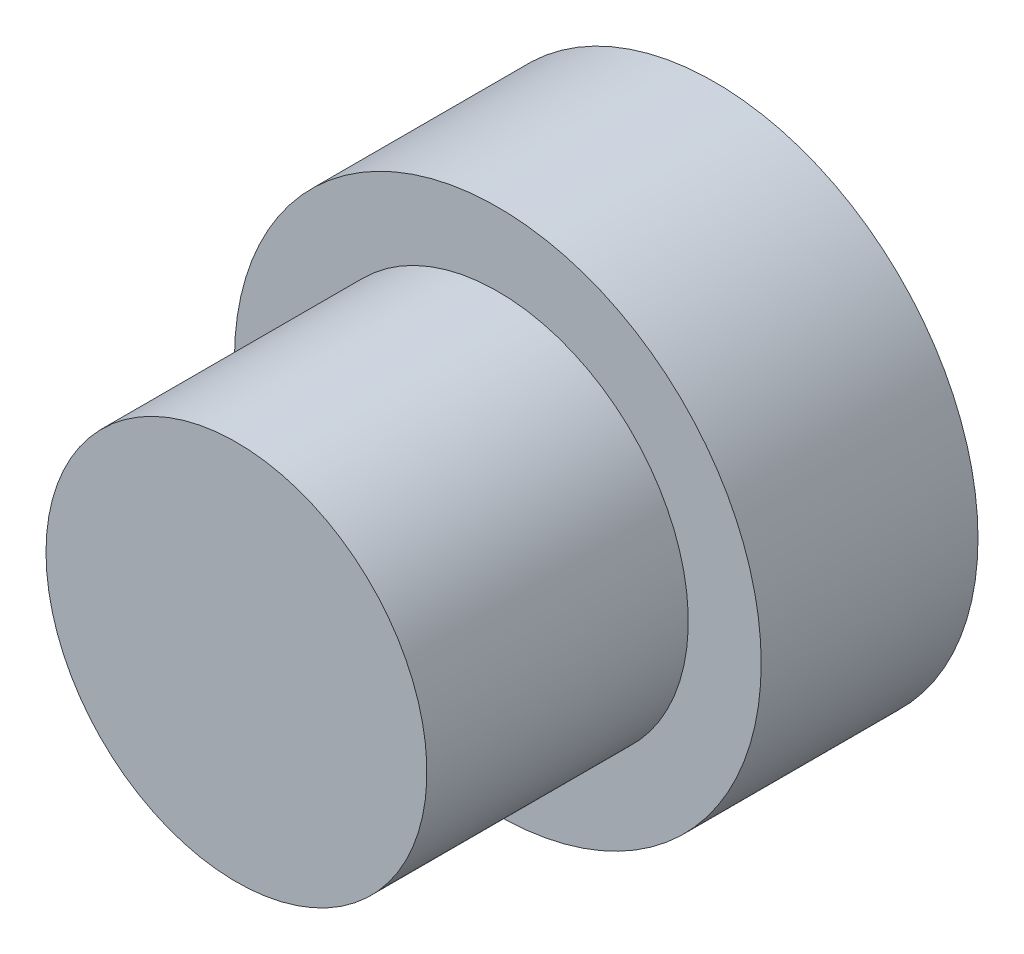
ISO-10303-21;
HEADER;
FILE_DESCRIPTION(('STEP AP214'),'2;1');
FILE_NAME('part.step','',(''),(''),'','','');
FILE_SCHEMA(('AUTOMOTIVE_DESIGN { 1 0 10303 214 1 1 1 1 }'));
ENDSEC;
DATA;
#1=APPLICATION_CONTEXT('core data for automotive mechanical design processes');
#2=APPLICATION_PROTOCOL_DEFINITION('international standard','automotive_design',2000,#1);
#3=PRODUCT_CONTEXT('',#1,'mechanical');
#4=PRODUCT('Part','Part','',(#3));
#5=PRODUCT_RELATED_PRODUCT_CATEGORY('part','',(#4));
#6=PRODUCT_DEFINITION_FORMATION('','',#4);
#7=PRODUCT_DEFINITION_CONTEXT('part definition',#1,'design');
#8=PRODUCT_DEFINITION('design','',#6,#7);
#9=PRODUCT_DEFINITION_SHAPE('','',#8);
#10=(LENGTH_UNIT() NAMED_UNIT(*) SI_UNIT(.MILLI.,.METRE.));
#11=(NAMED_UNIT(*) PLANE_ANGLE_UNIT() SI_UNIT($,.RADIAN.));
#12=(NAMED_UNIT(*) SI_UNIT($,.STERADIAN.) SOLID_ANGLE_UNIT());
#13=UNCERTAINTY_MEASURE_WITH_UNIT(LENGTH_MEASURE(1.E-05),#10,'distance_accuracy_value','');
#14=(GEOMETRIC_REPRESENTATION_CONTEXT(3) GLOBAL_UNCERTAINTY_ASSIGNED_CONTEXT((#13)) GLOBAL_UNIT_ASSIGNED_CONTEXT((#10,
#11,#12)) REPRESENTATION_CONTEXT('',''));
#15=CARTESIAN_POINT('',(0.,0.,0.));
#16=DIRECTION('',(0.,0.,1.));
#17=DIRECTION('',(1.,0.,0.));
#18=AXIS2_PLACEMENT_3D('',#15,#16,#17);
#19=CARTESIAN_POINT('',(12.9571489870418,-1.05465166173596,10.7));
#20=DIRECTION('',(0.,0.,-1.));
#21=DIRECTION('',(-1.,0.,0.));
#22=AXIS2_PLACEMENT_3D('',#19,#20,#21);
#23=CYLINDRICAL_SURFACE('',#22,13.);
#24=CARTESIAN_POINT('',(12.9571489870418,-1.05465166173596,10.7));
#25=DIRECTION('',(0.,0.,1.));
#26=DIRECTION('',(1.,0.,0.));
#27=AXIS2_PLACEMENT_3D('',#24,#25,#26);
#28=CIRCLE('',#27,13.);
#29=CARTESIAN_POINT('',(25.9571489870418,-1.05465166173596,10.7));
#30=VERTEX_POINT('',#29);
#31=EDGE_CURVE('E45',#30,#30,#28,.T.);
#32=ORIENTED_EDGE('',*,*,#31,.F.);
#33=EDGE_LOOP('',(#32));
#34=FACE_BOUND('',#33,.T.);
#35=CARTESIAN_POINT('',(12.9571489870418,-1.05465166173596,0.));
#36=DIRECTION('',(0.,0.,1.));
#37=DIRECTION('',(1.,0.,0.));
#38=AXIS2_PLACEMENT_3D('',#35,#36,#37);
#39=CIRCLE('',#38,13.);
#40=CARTESIAN_POINT('',(25.9571489870418,-1.05465166173596,0.));
#41=VERTEX_POINT('',#40);
#42=EDGE_CURVE('E40',#41,#41,#39,.T.);
#43=ORIENTED_EDGE('',*,*,#42,.T.);
#44=EDGE_LOOP('',(#43));
#45=FACE_BOUND('',#44,.T.);
#46=ADVANCED_FACE('F37',(#34,#45),#23,.T.);
#47=CARTESIAN_POINT('',(12.9571489870418,-1.05465166173596,10.7));
#48=DIRECTION('',(0.,0.,1.));
#49=DIRECTION('',(1.,0.,0.));
#50=AXIS2_PLACEMENT_3D('',#47,#48,#49);
#51=PLANE('',#50);
#52=CARTESIAN_POINT('',(12.9571489870418,-1.05465166173596,10.7));
#53=DIRECTION('',(0.,0.,1.));
#54=DIRECTION('',(1.,0.,0.));
#55=AXIS2_PLACEMENT_3D('',#52,#53,#54);
#56=CIRCLE('',#55,9.4);
#57=CARTESIAN_POINT('',(3.55714898704176,-1.05465166173596,10.7));
#58=VERTEX_POINT('',#57);
#59=EDGE_CURVE('E10',#58,#58,#56,.T.);
#60=ORIENTED_EDGE('',*,*,#59,.F.);
#61=EDGE_LOOP('',(#60));
#62=FACE_BOUND('',#61,.T.);
#63=ORIENTED_EDGE('',*,*,#31,.T.);
#64=EDGE_LOOP('',(#63));
#65=FACE_BOUND('',#64,.T.);
#66=ADVANCED_FACE('F65',(#62,#65),#51,.T.);
#67=CARTESIAN_POINT('',(12.9571489870418,-1.05465166173596,0.));
#68=DIRECTION('',(0.,0.,1.));
#69=DIRECTION('',(1.,0.,0.));
#70=AXIS2_PLACEMENT_3D('',#67,#68,#69);
#71=PLANE('',#70);
#72=ORIENTED_EDGE('',*,*,#42,.F.);
#73=EDGE_LOOP('',(#72));
#74=FACE_BOUND('',#73,.T.);
#75=ADVANCED_FACE('F62',(#74),#71,.F.);
#76=CARTESIAN_POINT('',(12.9571489870418,-1.05465166173596,23.6));
#77=DIRECTION('',(0.,0.,-1.));
#78=DIRECTION('',(-1.,0.,0.));
#79=AXIS2_PLACEMENT_3D('',#76,#77,#78);
#80=CYLINDRICAL_SURFACE('',#79,9.4);
#81=CARTESIAN_POINT('',(12.9571489870418,-1.05465166173596,23.6));
#82=DIRECTION('',(0.,0.,1.));
#83=DIRECTION('',(1.,0.,0.));
#84=AXIS2_PLACEMENT_3D('',#81,#82,#83);
#85=CIRCLE('',#84,9.4);
#86=CARTESIAN_POINT('',(3.55714898704176,-1.05465166173596,23.6));
#87=VERTEX_POINT('',#86);
#88=EDGE_CURVE('E52',#87,#87,#85,.T.);
#89=CARTESIAN_POINT('',(3.55714898704176,-1.05465166173596,23.6));
#90=CARTESIAN_POINT('',(3.55714898704176,-1.05465166173596,23.465625));
#91=CARTESIAN_POINT('',(3.55714898704176,-1.05465166173596,23.33125));
#92=CARTESIAN_POINT('',(3.55714898704176,-1.05465166173596,23.0625));
#93=CARTESIAN_POINT('',(3.55714898704176,-1.05465166173596,22.928125));
#94=CARTESIAN_POINT('',(3.55714898704176,-1.05465166173596,22.659375));
#95=CARTESIAN_POINT('',(3.55714898704176,-1.05465166173596,22.525));
#96=CARTESIAN_POINT('',(3.55714898704176,-1.05465166173596,22.25625));
#97=CARTESIAN_POINT('',(3.55714898704176,-1.05465166173596,22.121875));
#98=CARTESIAN_POINT('',(3.55714898704176,-1.05465166173596,21.853125));
#99=CARTESIAN_POINT('',(3.55714898704176,-1.05465166173596,21.71875));
#100=CARTESIAN_POINT('',(3.55714898704176,-1.05465166173596,21.45));
#101=CARTESIAN_POINT('',(3.55714898704176,-1.05465166173596,21.315625));
#102=CARTESIAN_POINT('',(3.55714898704176,-1.05465166173596,21.046875));
#103=CARTESIAN_POINT('',(3.55714898704176,-1.05465166173596,20.9125));
#104=CARTESIAN_POINT('',(3.55714898704176,-1.05465166173596,20.64375));
#105=CARTESIAN_POINT('',(3.55714898704176,-1.05465166173596,20.509375));
#106=CARTESIAN_POINT('',(3.55714898704176,-1.05465166173596,20.240625));
#107=CARTESIAN_POINT('',(3.55714898704176,-1.05465166173596,20.10625));
#108=CARTESIAN_POINT('',(3.55714898704176,-1.05465166173596,19.8375));
#109=CARTESIAN_POINT('',(3.55714898704176,-1.05465166173596,19.703125));
#110=CARTESIAN_POINT('',(3.55714898704176,-1.05465166173596,19.434375));
#111=CARTESIAN_POINT('',(3.55714898704176,-1.05465166173596,19.3));
#112=CARTESIAN_POINT('',(3.55714898704176,-1.05465166173596,19.03125));
#113=CARTESIAN_POINT('',(3.55714898704176,-1.05465166173596,18.896875));
#114=CARTESIAN_POINT('',(3.55714898704176,-1.05465166173596,18.628125));
#115=CARTESIAN_POINT('',(3.55714898704176,-1.05465166173596,18.49375));
#116=CARTESIAN_POINT('',(3.55714898704176,-1.05465166173596,18.225));
#117=CARTESIAN_POINT('',(3.55714898704176,-1.05465166173596,18.090625));
#118=CARTESIAN_POINT('',(3.55714898704176,-1.05465166173596,17.821875));
#119=CARTESIAN_POINT('',(3.55714898704176,-1.05465166173596,17.6875));
#120=CARTESIAN_POINT('',(3.55714898704176,-1.05465166173596,17.41875));
#121=CARTESIAN_POINT('',(3.55714898704176,-1.05465166173596,17.284375));
#122=CARTESIAN_POINT('',(3.55714898704176,-1.05465166173596,17.015625));
#123=CARTESIAN_POINT('',(3.55714898704176,-1.05465166173596,16.88125));
#124=CARTESIAN_POINT('',(3.55714898704176,-1.05465166173596,16.6125));
#125=CARTESIAN_POINT('',(3.55714898704176,-1.05465166173596,16.478125));
#126=CARTESIAN_POINT('',(3.55714898704176,-1.05465166173596,16.209375));
#127=CARTESIAN_POINT('',(3.55714898704176,-1.05465166173596,16.075));
#128=CARTESIAN_POINT('',(3.55714898704176,-1.05465166173596,15.80625));
#129=CARTESIAN_POINT('',(3.55714898704176,-1.05465166173596,15.671875));
#130=CARTESIAN_POINT('',(3.55714898704176,-1.05465166173596,15.403125));
#131=CARTESIAN_POINT('',(3.55714898704176,-1.05465166173596,15.26875));
#132=CARTESIAN_POINT('',(3.55714898704176,-1.05465166173596,15.));
#133=CARTESIAN_POINT('',(3.55714898704176,-1.05465166173596,14.865625));
#134=CARTESIAN_POINT('',(3.55714898704176,-1.05465166173596,14.596875));
#135=CARTESIAN_POINT('',(3.55714898704176,-1.05465166173596,14.4625));
#136=CARTESIAN_POINT('',(3.55714898704176,-1.05465166173596,14.19375));
#137=CARTESIAN_POINT('',(3.55714898704176,-1.05465166173596,14.059375));
#138=CARTESIAN_POINT('',(3.55714898704176,-1.05465166173596,13.790625));
#139=CARTESIAN_POINT('',(3.55714898704176,-1.05465166173596,13.65625));
#140=CARTESIAN_POINT('',(3.55714898704176,-1.05465166173596,13.3875));
#141=CARTESIAN_POINT('',(3.55714898704176,-1.05465166173596,13.253125));
#142=CARTESIAN_POINT('',(3.55714898704176,-1.05465166173596,12.984375));
#143=CARTESIAN_POINT('',(3.55714898704176,-1.05465166173596,12.85));
#144=CARTESIAN_POINT('',(3.55714898704176,-1.05465166173596,12.58125));
#145=CARTESIAN_POINT('',(3.55714898704176,-1.05465166173596,12.446875));
#146=CARTESIAN_POINT('',(3.55714898704176,-1.05465166173596,12.178125));
#147=CARTESIAN_POINT('',(3.55714898704176,-1.05465166173596,12.04375));
#148=CARTESIAN_POINT('',(3.55714898704176,-1.05465166173596,11.775));
#149=CARTESIAN_POINT('',(3.55714898704176,-1.05465166173596,11.640625));
#150=CARTESIAN_POINT('',(3.55714898704176,-1.05465166173596,11.371875));
#151=CARTESIAN_POINT('',(3.55714898704176,-1.05465166173596,11.2375));
#152=CARTESIAN_POINT('',(3.55714898704176,-1.05465166173596,10.96875));
#153=CARTESIAN_POINT('',(3.55714898704176,-1.05465166173596,10.834375));
#154=CARTESIAN_POINT('',(3.55714898704176,-1.05465166173596,10.7));
#155=B_SPLINE_CURVE_WITH_KNOTS('',3,(#89,#90,#91,#92,#93,#94,#95,#96,#97,#98,#99,#100,#101,#102,
#103,#104,#105,#106,#107,#108,#109,#110,#111,#112,#113,#114,#115,#116,#117,#118,#119,#120,#121,
#122,#123,#124,#125,#126,#127,#128,#129,#130,#131,#132,#133,#134,#135,#136,#137,#138,#139,#140,
#141,#142,#143,#144,#145,#146,#147,#148,#149,#150,#151,#152,#153,#154),.UNSPECIFIED.,.F.,.F.,(4,
2,2,2,2,2,2,2,2,2,2,2,2,2,2,2,2,2,2,2,2,2,2,2,2,2,2,2,2,2,2,2,4),(0.,0.403125000000001,
0.806250000000001,1.209375,1.6125,2.015625,2.41875,2.821875,3.225,3.628125,4.03125,4.434375,
4.8375,5.240625,5.64375,6.046875,6.45,6.853125,7.25625,7.659375,8.0625,8.465625,8.86875,
9.271875,9.675,10.078125,10.48125,10.884375,11.2875,11.690625,12.09375,12.496875,12.9),.UNSPECIFIED.);
#156=EDGE_CURVE('BSEAM64',#87,#58,#155,.T.);
#157=ORIENTED_EDGE('',*,*,#88,.F.);
#158=ORIENTED_EDGE('',*,*,#59,.T.);
#159=ORIENTED_EDGE('',*,*,#156,.T.);
#160=ORIENTED_EDGE('',*,*,#156,.F.);
#161=EDGE_LOOP('',(#157,#159,#158,#160));
#162=FACE_BOUND('',#161,.T.);
#163=ADVANCED_FACE('F64',(#162),#80,.T.);
#164=CARTESIAN_POINT('',(12.9571489870418,-1.05465166173596,23.6));
#165=DIRECTION('',(0.,0.,1.));
#166=DIRECTION('',(1.,0.,0.));
#167=AXIS2_PLACEMENT_3D('',#164,#165,#166);
#168=PLANE('',#167);
#169=ORIENTED_EDGE('',*,*,#88,.T.);
#170=EDGE_LOOP('',(#169));
#171=FACE_BOUND('',#170,.T.);
#172=ADVANCED_FACE('F70',(#171),#168,.T.);
#173=CLOSED_SHELL('',(#46,#66,#75,#163,#172));
#174=MANIFOLD_SOLID_BREP('B2',#173);
#175=ADVANCED_BREP_SHAPE_REPRESENTATION('',(#18,#174),#14);
#176=SHAPE_DEFINITION_REPRESENTATION(#9,#175);
ENDSEC;
END-ISO-10303-21;
